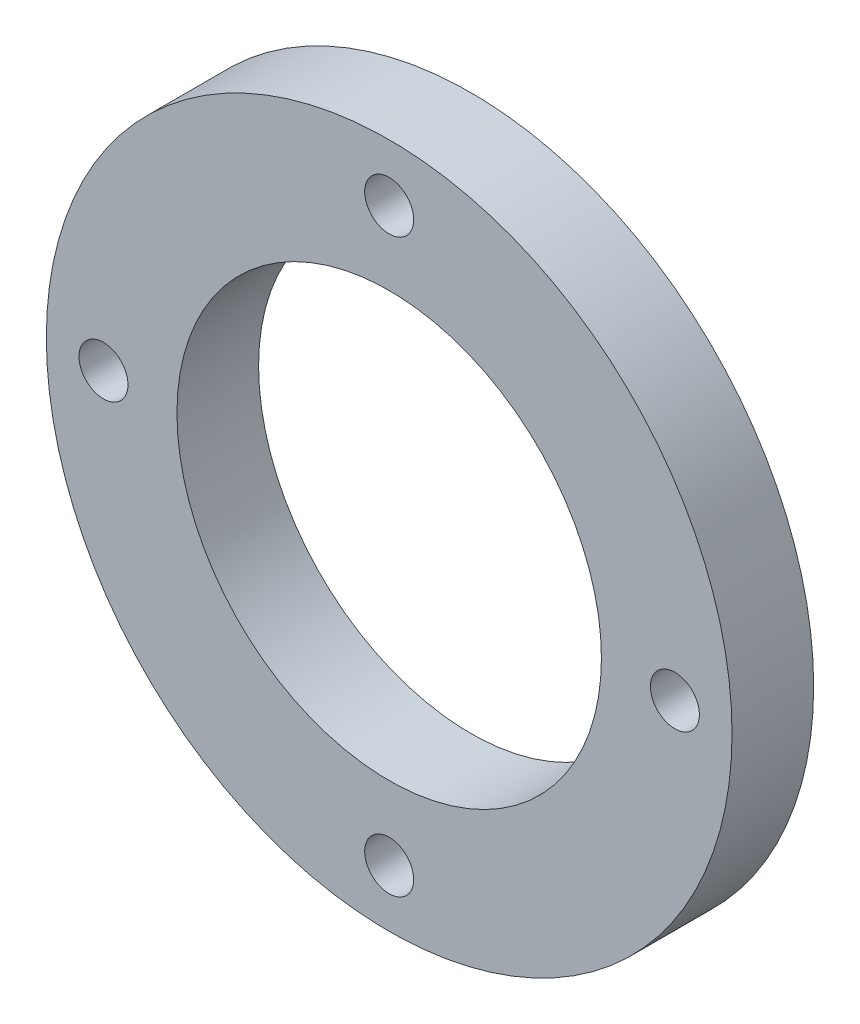
ISO-10303-21;
HEADER;
FILE_DESCRIPTION(('STEP AP214'),'2;1');
FILE_NAME('part.step','',(''),(''),'','','');
FILE_SCHEMA(('AUTOMOTIVE_DESIGN { 1 0 10303 214 1 1 1 1 }'));
ENDSEC;
DATA;
#1=APPLICATION_CONTEXT('core data for automotive mechanical design processes');
#2=APPLICATION_PROTOCOL_DEFINITION('international standard','automotive_design',2000,#1);
#3=PRODUCT_CONTEXT('',#1,'mechanical');
#4=PRODUCT('Part','Part','',(#3));
#5=PRODUCT_RELATED_PRODUCT_CATEGORY('part','',(#4));
#6=PRODUCT_DEFINITION_FORMATION('','',#4);
#7=PRODUCT_DEFINITION_CONTEXT('part definition',#1,'design');
#8=PRODUCT_DEFINITION('design','',#6,#7);
#9=PRODUCT_DEFINITION_SHAPE('','',#8);
#10=(LENGTH_UNIT() NAMED_UNIT(*) SI_UNIT(.MILLI.,.METRE.));
#11=(NAMED_UNIT(*) PLANE_ANGLE_UNIT() SI_UNIT($,.RADIAN.));
#12=(NAMED_UNIT(*) SI_UNIT($,.STERADIAN.) SOLID_ANGLE_UNIT());
#13=UNCERTAINTY_MEASURE_WITH_UNIT(LENGTH_MEASURE(1.E-05),#10,'distance_accuracy_value','');
#14=(GEOMETRIC_REPRESENTATION_CONTEXT(3) GLOBAL_UNCERTAINTY_ASSIGNED_CONTEXT((#13)) GLOBAL_UNIT_ASSIGNED_CONTEXT((#10,
#11,#12)) REPRESENTATION_CONTEXT('',''));
#15=CARTESIAN_POINT('',(0.,0.,0.));
#16=DIRECTION('',(0.,0.,1.));
#17=DIRECTION('',(1.,0.,0.));
#18=AXIS2_PLACEMENT_3D('',#15,#16,#17);
#19=CARTESIAN_POINT('',(49.,5.00000000000002,5.));
#20=DIRECTION('',(0.,0.,1.));
#21=DIRECTION('',(1.,0.,0.));
#22=AXIS2_PLACEMENT_3D('',#19,#20,#21);
#23=PLANE('',#22);
#24=CARTESIAN_POINT('',(66.5,5.00000000000002,5.));
#25=DIRECTION('',(0.,0.,1.));
#26=DIRECTION('',(1.,0.,0.));
#27=AXIS2_PLACEMENT_3D('',#24,#25,#26);
#28=CIRCLE('',#27,1.5);
#29=CARTESIAN_POINT('',(68.,5.00000000000002,5.));
#30=VERTEX_POINT('',#29);
#31=EDGE_CURVE('E69',#30,#30,#28,.T.);
#32=ORIENTED_EDGE('',*,*,#31,.F.);
#33=EDGE_LOOP('',(#32));
#34=FACE_BOUND('',#33,.T.);
#35=CARTESIAN_POINT('',(31.5,5.00000000000003,5.));
#36=DIRECTION('',(0.,0.,1.));
#37=DIRECTION('',(1.,0.,0.));
#38=AXIS2_PLACEMENT_3D('',#35,#36,#37);
#39=CIRCLE('',#38,1.5);
#40=CARTESIAN_POINT('',(33.,5.00000000000003,5.));
#41=VERTEX_POINT('',#40);
#42=EDGE_CURVE('E57',#41,#41,#39,.T.);
#43=ORIENTED_EDGE('',*,*,#42,.F.);
#44=EDGE_LOOP('',(#43));
#45=FACE_BOUND('',#44,.T.);
#46=CARTESIAN_POINT('',(49.,5.00000000000002,5.));
#47=DIRECTION('',(0.,0.,1.));
#48=DIRECTION('',(1.,0.,0.));
#49=AXIS2_PLACEMENT_3D('',#46,#47,#48);
#50=CIRCLE('',#49,21.);
#51=CARTESIAN_POINT('',(70.,5.00000000000002,5.));
#52=VERTEX_POINT('',#51);
#53=EDGE_CURVE('E12',#52,#52,#50,.T.);
#54=ORIENTED_EDGE('',*,*,#53,.T.);
#55=EDGE_LOOP('',(#54));
#56=FACE_BOUND('',#55,.T.);
#57=CARTESIAN_POINT('',(49.,5.00000000000002,5.));
#58=DIRECTION('',(0.,0.,1.));
#59=DIRECTION('',(1.,0.,0.));
#60=AXIS2_PLACEMENT_3D('',#57,#58,#59);
#61=CIRCLE('',#60,13.);
#62=CARTESIAN_POINT('',(62.,5.00000000000002,5.));
#63=VERTEX_POINT('',#62);
#64=EDGE_CURVE('E52',#63,#63,#61,.T.);
#65=ORIENTED_EDGE('',*,*,#64,.F.);
#66=EDGE_LOOP('',(#65));
#67=FACE_BOUND('',#66,.T.);
#68=CARTESIAN_POINT('',(49.,22.5,5.));
#69=DIRECTION('',(0.,0.,1.));
#70=DIRECTION('',(1.,0.,0.));
#71=AXIS2_PLACEMENT_3D('',#68,#69,#70);
#72=CIRCLE('',#71,1.5);
#73=CARTESIAN_POINT('',(50.5,22.5,5.));
#74=VERTEX_POINT('',#73);
#75=EDGE_CURVE('E63',#74,#74,#72,.T.);
#76=ORIENTED_EDGE('',*,*,#75,.F.);
#77=EDGE_LOOP('',(#76));
#78=FACE_BOUND('',#77,.T.);
#79=CARTESIAN_POINT('',(49.,-12.5,5.));
#80=DIRECTION('',(0.,0.,1.));
#81=DIRECTION('',(1.,0.,0.));
#82=AXIS2_PLACEMENT_3D('',#79,#80,#81);
#83=CIRCLE('',#82,1.5);
#84=CARTESIAN_POINT('',(50.5,-12.5,5.));
#85=VERTEX_POINT('',#84);
#86=EDGE_CURVE('E75',#85,#85,#83,.T.);
#87=ORIENTED_EDGE('',*,*,#86,.F.);
#88=EDGE_LOOP('',(#87));
#89=FACE_BOUND('',#88,.T.);
#90=ADVANCED_FACE('F41',(#34,#45,#56,#67,#78,#89),#23,.T.);
#91=CARTESIAN_POINT('',(49.,5.00000000000002,0.));
#92=DIRECTION('',(0.,0.,1.));
#93=DIRECTION('',(1.,0.,0.));
#94=AXIS2_PLACEMENT_3D('',#91,#92,#93);
#95=PLANE('',#94);
#96=CARTESIAN_POINT('',(49.,5.00000000000002,0.));
#97=DIRECTION('',(0.,0.,1.));
#98=DIRECTION('',(1.,0.,0.));
#99=AXIS2_PLACEMENT_3D('',#96,#97,#98);
#100=CIRCLE('',#99,21.);
#101=CARTESIAN_POINT('',(70.,5.00000000000002,0.));
#102=VERTEX_POINT('',#101);
#103=EDGE_CURVE('E45',#102,#102,#100,.T.);
#104=ORIENTED_EDGE('',*,*,#103,.F.);
#105=EDGE_LOOP('',(#104));
#106=FACE_BOUND('',#105,.T.);
#107=CARTESIAN_POINT('',(49.,5.00000000000002,0.));
#108=DIRECTION('',(0.,0.,1.));
#109=DIRECTION('',(1.,0.,0.));
#110=AXIS2_PLACEMENT_3D('',#107,#108,#109);
#111=CIRCLE('',#110,13.);
#112=CARTESIAN_POINT('',(62.,5.00000000000002,0.));
#113=VERTEX_POINT('',#112);
#114=EDGE_CURVE('E54',#113,#113,#111,.T.);
#115=ORIENTED_EDGE('',*,*,#114,.T.);
#116=EDGE_LOOP('',(#115));
#117=FACE_BOUND('',#116,.T.);
#118=CARTESIAN_POINT('',(31.5,5.00000000000003,0.));
#119=DIRECTION('',(0.,0.,1.));
#120=DIRECTION('',(1.,0.,0.));
#121=AXIS2_PLACEMENT_3D('',#118,#119,#120);
#122=CIRCLE('',#121,1.5);
#123=CARTESIAN_POINT('',(33.,5.00000000000003,0.));
#124=VERTEX_POINT('',#123);
#125=EDGE_CURVE('E60',#124,#124,#122,.T.);
#126=ORIENTED_EDGE('',*,*,#125,.T.);
#127=EDGE_LOOP('',(#126));
#128=FACE_BOUND('',#127,.T.);
#129=CARTESIAN_POINT('',(49.,22.5,0.));
#130=DIRECTION('',(0.,0.,1.));
#131=DIRECTION('',(1.,0.,0.));
#132=AXIS2_PLACEMENT_3D('',#129,#130,#131);
#133=CIRCLE('',#132,1.5);
#134=CARTESIAN_POINT('',(50.5,22.5,0.));
#135=VERTEX_POINT('',#134);
#136=EDGE_CURVE('E66',#135,#135,#133,.T.);
#137=ORIENTED_EDGE('',*,*,#136,.T.);
#138=EDGE_LOOP('',(#137));
#139=FACE_BOUND('',#138,.T.);
#140=CARTESIAN_POINT('',(66.5,5.00000000000002,0.));
#141=DIRECTION('',(0.,0.,1.));
#142=DIRECTION('',(1.,0.,0.));
#143=AXIS2_PLACEMENT_3D('',#140,#141,#142);
#144=CIRCLE('',#143,1.5);
#145=CARTESIAN_POINT('',(68.,5.00000000000002,0.));
#146=VERTEX_POINT('',#145);
#147=EDGE_CURVE('E72',#146,#146,#144,.T.);
#148=ORIENTED_EDGE('',*,*,#147,.T.);
#149=EDGE_LOOP('',(#148));
#150=FACE_BOUND('',#149,.T.);
#151=CARTESIAN_POINT('',(49.,-12.5,0.));
#152=DIRECTION('',(0.,0.,1.));
#153=DIRECTION('',(1.,0.,0.));
#154=AXIS2_PLACEMENT_3D('',#151,#152,#153);
#155=CIRCLE('',#154,1.5);
#156=CARTESIAN_POINT('',(50.5,-12.5,0.));
#157=VERTEX_POINT('',#156);
#158=EDGE_CURVE('E78',#157,#157,#155,.T.);
#159=ORIENTED_EDGE('',*,*,#158,.T.);
#160=EDGE_LOOP('',(#159));
#161=FACE_BOUND('',#160,.T.);
#162=ADVANCED_FACE('F88',(#106,#117,#128,#139,#150,#161),#95,.F.);
#163=CARTESIAN_POINT('',(49.,5.00000000000002,5.));
#164=DIRECTION('',(0.,0.,-1.));
#165=DIRECTION('',(-1.,0.,0.));
#166=AXIS2_PLACEMENT_3D('',#163,#164,#165);
#167=CYLINDRICAL_SURFACE('',#166,21.);
#168=ORIENTED_EDGE('',*,*,#53,.F.);
#169=EDGE_LOOP('',(#168));
#170=FACE_BOUND('',#169,.T.);
#171=ORIENTED_EDGE('',*,*,#103,.T.);
#172=EDGE_LOOP('',(#171));
#173=FACE_BOUND('',#172,.T.);
#174=ADVANCED_FACE('F43',(#170,#173),#167,.T.);
#175=CARTESIAN_POINT('',(49.,5.00000000000002,5.));
#176=DIRECTION('',(0.,0.,-1.));
#177=DIRECTION('',(-1.,0.,0.));
#178=AXIS2_PLACEMENT_3D('',#175,#176,#177);
#179=CYLINDRICAL_SURFACE('',#178,13.);
#180=ORIENTED_EDGE('',*,*,#64,.T.);
#181=EDGE_LOOP('',(#180));
#182=FACE_BOUND('',#181,.T.);
#183=ORIENTED_EDGE('',*,*,#114,.F.);
#184=EDGE_LOOP('',(#183));
#185=FACE_BOUND('',#184,.T.);
#186=ADVANCED_FACE('F98',(#182,#185),#179,.F.);
#187=CARTESIAN_POINT('',(31.5,5.00000000000003,5.));
#188=DIRECTION('',(0.,0.,-1.));
#189=DIRECTION('',(-1.,0.,0.));
#190=AXIS2_PLACEMENT_3D('',#187,#188,#189);
#191=CYLINDRICAL_SURFACE('',#190,1.5);
#192=ORIENTED_EDGE('',*,*,#42,.T.);
#193=EDGE_LOOP('',(#192));
#194=FACE_BOUND('',#193,.T.);
#195=ORIENTED_EDGE('',*,*,#125,.F.);
#196=EDGE_LOOP('',(#195));
#197=FACE_BOUND('',#196,.T.);
#198=ADVANCED_FACE('F101',(#194,#197),#191,.F.);
#199=CARTESIAN_POINT('',(49.,22.5,5.));
#200=DIRECTION('',(0.,0.,-1.));
#201=DIRECTION('',(-1.,0.,0.));
#202=AXIS2_PLACEMENT_3D('',#199,#200,#201);
#203=CYLINDRICAL_SURFACE('',#202,1.5);
#204=ORIENTED_EDGE('',*,*,#75,.T.);
#205=EDGE_LOOP('',(#204));
#206=FACE_BOUND('',#205,.T.);
#207=ORIENTED_EDGE('',*,*,#136,.F.);
#208=EDGE_LOOP('',(#207));
#209=FACE_BOUND('',#208,.T.);
#210=ADVANCED_FACE('F105',(#206,#209),#203,.F.);
#211=CARTESIAN_POINT('',(66.5,5.00000000000002,5.));
#212=DIRECTION('',(0.,0.,-1.));
#213=DIRECTION('',(-1.,0.,0.));
#214=AXIS2_PLACEMENT_3D('',#211,#212,#213);
#215=CYLINDRICAL_SURFACE('',#214,1.5);
#216=ORIENTED_EDGE('',*,*,#31,.T.);
#217=EDGE_LOOP('',(#216));
#218=FACE_BOUND('',#217,.T.);
#219=ORIENTED_EDGE('',*,*,#147,.F.);
#220=EDGE_LOOP('',(#219));
#221=FACE_BOUND('',#220,.T.);
#222=ADVANCED_FACE('F109',(#218,#221),#215,.F.);
#223=CARTESIAN_POINT('',(49.,-12.5,5.));
#224=DIRECTION('',(0.,0.,-1.));
#225=DIRECTION('',(-1.,0.,0.));
#226=AXIS2_PLACEMENT_3D('',#223,#224,#225);
#227=CYLINDRICAL_SURFACE('',#226,1.5);
#228=ORIENTED_EDGE('',*,*,#86,.T.);
#229=EDGE_LOOP('',(#228));
#230=FACE_BOUND('',#229,.T.);
#231=ORIENTED_EDGE('',*,*,#158,.F.);
#232=EDGE_LOOP('',(#231));
#233=FACE_BOUND('',#232,.T.);
#234=ADVANCED_FACE('F84',(#230,#233),#227,.F.);
#235=CLOSED_SHELL('',(#90,#162,#174,#186,#198,#210,#222,#234));
#236=MANIFOLD_SOLID_BREP('B2',#235);
#237=ADVANCED_BREP_SHAPE_REPRESENTATION('',(#18,#236),#14);
#238=SHAPE_DEFINITION_REPRESENTATION(#9,#237);
ENDSEC;
END-ISO-10303-21;
